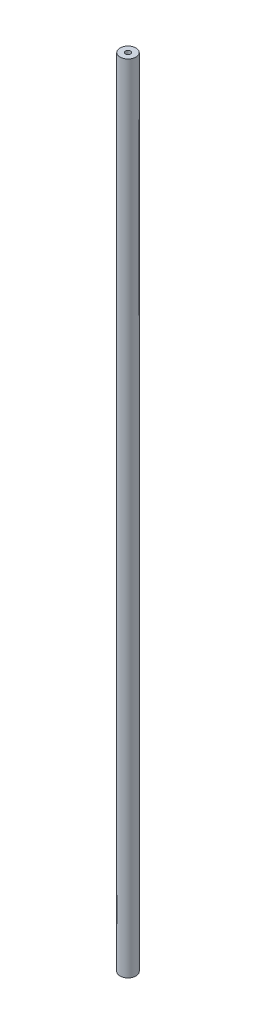
ISO-10303-21;
HEADER;
FILE_DESCRIPTION(('STEP AP214'),'2;1');
FILE_NAME('part.step','',(''),(''),'','','');
FILE_SCHEMA(('AUTOMOTIVE_DESIGN { 1 0 10303 214 1 1 1 1 }'));
ENDSEC;
DATA;
#1=APPLICATION_CONTEXT('core data for automotive mechanical design processes');
#2=APPLICATION_PROTOCOL_DEFINITION('international standard','automotive_design',2000,#1);
#3=PRODUCT_CONTEXT('',#1,'mechanical');
#4=PRODUCT('Part','Part','',(#3));
#5=PRODUCT_RELATED_PRODUCT_CATEGORY('part','',(#4));
#6=PRODUCT_DEFINITION_FORMATION('','',#4);
#7=PRODUCT_DEFINITION_CONTEXT('part definition',#1,'design');
#8=PRODUCT_DEFINITION('design','',#6,#7);
#9=PRODUCT_DEFINITION_SHAPE('','',#8);
#10=(LENGTH_UNIT() NAMED_UNIT(*) SI_UNIT(.MILLI.,.METRE.));
#11=(NAMED_UNIT(*) PLANE_ANGLE_UNIT() SI_UNIT($,.RADIAN.));
#12=(NAMED_UNIT(*) SI_UNIT($,.STERADIAN.) SOLID_ANGLE_UNIT());
#13=UNCERTAINTY_MEASURE_WITH_UNIT(LENGTH_MEASURE(1.E-05),#10,'distance_accuracy_value','');
#14=(GEOMETRIC_REPRESENTATION_CONTEXT(3) GLOBAL_UNCERTAINTY_ASSIGNED_CONTEXT((#13)) GLOBAL_UNIT_ASSIGNED_CONTEXT((#10,
#11,#12)) REPRESENTATION_CONTEXT('',''));
#15=CARTESIAN_POINT('',(0.,0.,0.));
#16=DIRECTION('',(0.,0.,1.));
#17=DIRECTION('',(1.,0.,0.));
#18=AXIS2_PLACEMENT_3D('',#15,#16,#17);
#19=CARTESIAN_POINT('',(0.,634.492,0.));
#20=DIRECTION('',(0.,-1.,0.));
#21=DIRECTION('',(0.,0.,-1.));
#22=AXIS2_PLACEMENT_3D('',#19,#20,#21);
#23=CYLINDRICAL_SURFACE('',#22,6.35);
#24=CARTESIAN_POINT('',(0.,634.492,0.));
#25=DIRECTION('',(0.,1.,0.));
#26=DIRECTION('',(0.,0.,1.));
#27=AXIS2_PLACEMENT_3D('',#24,#25,#26);
#28=CIRCLE('',#27,6.35);
#29=CARTESIAN_POINT('',(0.,634.492,6.35));
#30=VERTEX_POINT('',#29);
#31=EDGE_CURVE('E11',#30,#30,#28,.T.);
#32=ORIENTED_EDGE('',*,*,#31,.F.);
#33=EDGE_LOOP('',(#32));
#34=FACE_BOUND('',#33,.T.);
#35=CARTESIAN_POINT('',(0.,0.,0.));
#36=DIRECTION('',(0.,1.,0.));
#37=DIRECTION('',(0.,0.,1.));
#38=AXIS2_PLACEMENT_3D('',#35,#36,#37);
#39=CIRCLE('',#38,6.35);
#40=CARTESIAN_POINT('',(0.,0.,6.35));
#41=VERTEX_POINT('',#40);
#42=EDGE_CURVE('E52',#41,#41,#39,.T.);
#43=ORIENTED_EDGE('',*,*,#42,.T.);
#44=EDGE_LOOP('',(#43));
#45=FACE_BOUND('',#44,.T.);
#46=ADVANCED_FACE('F49',(#34,#45),#23,.T.);
#47=CARTESIAN_POINT('',(0.,634.492,0.));
#48=DIRECTION('',(0.,1.,0.));
#49=DIRECTION('',(0.,0.,1.));
#50=AXIS2_PLACEMENT_3D('',#47,#48,#49);
#51=PLANE('',#50);
#52=CARTESIAN_POINT('',(0.,634.492,0.));
#53=DIRECTION('',(0.,1.,0.));
#54=DIRECTION('',(0.,0.,1.));
#55=AXIS2_PLACEMENT_3D('',#52,#53,#54);
#56=CIRCLE('',#55,2.0193);
#57=CARTESIAN_POINT('',(0.,634.492,2.0193));
#58=VERTEX_POINT('',#57);
#59=EDGE_CURVE('E75',#58,#58,#56,.T.);
#60=ORIENTED_EDGE('',*,*,#59,.F.);
#61=EDGE_LOOP('',(#60));
#62=FACE_BOUND('',#61,.T.);
#63=ORIENTED_EDGE('',*,*,#31,.T.);
#64=EDGE_LOOP('',(#63));
#65=FACE_BOUND('',#64,.T.);
#66=ADVANCED_FACE('F97',(#62,#65),#51,.T.);
#67=CARTESIAN_POINT('',(0.,0.,0.));
#68=DIRECTION('',(0.,1.,0.));
#69=DIRECTION('',(0.,0.,1.));
#70=AXIS2_PLACEMENT_3D('',#67,#68,#69);
#71=PLANE('',#70);
#72=CARTESIAN_POINT('',(0.,0.,0.));
#73=DIRECTION('',(0.,-1.,0.));
#74=DIRECTION('',(0.,0.,-1.));
#75=AXIS2_PLACEMENT_3D('',#72,#73,#74);
#76=CIRCLE('',#75,2.0193);
#77=CARTESIAN_POINT('',(0.,0.,-2.0193));
#78=VERTEX_POINT('',#77);
#79=EDGE_CURVE('E74',#78,#78,#76,.T.);
#80=ORIENTED_EDGE('',*,*,#79,.F.);
#81=EDGE_LOOP('',(#80));
#82=FACE_BOUND('',#81,.T.);
#83=ORIENTED_EDGE('',*,*,#42,.F.);
#84=EDGE_LOOP('',(#83));
#85=FACE_BOUND('',#84,.T.);
#86=ADVANCED_FACE('F94',(#82,#85),#71,.F.);
#87=CARTESIAN_POINT('',(0.,12.02944,0.));
#88=DIRECTION('',(0.,-1.,0.));
#89=DIRECTION('',(0.,0.,-1.));
#90=AXIS2_PLACEMENT_3D('',#87,#88,#89);
#91=CONICAL_SURFACE('',#90,2.0193,1.02974425867665);
#92=CARTESIAN_POINT('',(0.,13.2427578480024,0.));
#93=VERTEX_POINT('',#92);
#94=VERTEX_LOOP('',#93);
#95=FACE_BOUND('',#94,.T.);
#96=CARTESIAN_POINT('',(0.,12.02944,0.));
#97=DIRECTION('',(0.,-1.,0.));
#98=DIRECTION('',(0.,0.,-1.));
#99=AXIS2_PLACEMENT_3D('',#96,#97,#98);
#100=CIRCLE('',#99,2.0193);
#101=CARTESIAN_POINT('',(0.,12.02944,-2.0193));
#102=VERTEX_POINT('',#101);
#103=EDGE_CURVE('E80',#102,#102,#100,.T.);
#104=ORIENTED_EDGE('',*,*,#103,.T.);
#105=EDGE_LOOP('',(#104));
#106=FACE_BOUND('',#105,.T.);
#107=ADVANCED_FACE('F96',(#95,#106),#91,.F.);
#108=CARTESIAN_POINT('',(0.,0.,0.));
#109=DIRECTION('',(0.,-1.,0.));
#110=DIRECTION('',(0.,0.,-1.));
#111=AXIS2_PLACEMENT_3D('',#108,#109,#110);
#112=CYLINDRICAL_SURFACE('',#111,2.0193);
#113=ORIENTED_EDGE('',*,*,#103,.F.);
#114=EDGE_LOOP('',(#113));
#115=FACE_BOUND('',#114,.T.);
#116=ORIENTED_EDGE('',*,*,#79,.T.);
#117=EDGE_LOOP('',(#116));
#118=FACE_BOUND('',#117,.T.);
#119=ADVANCED_FACE('F67',(#115,#118),#112,.F.);
#120=CARTESIAN_POINT('',(0.,622.46256,0.));
#121=DIRECTION('',(0.,1.,0.));
#122=DIRECTION('',(0.,0.,1.));
#123=AXIS2_PLACEMENT_3D('',#120,#121,#122);
#124=CONICAL_SURFACE('',#123,2.0193,1.02974425867664);
#125=CARTESIAN_POINT('',(0.,621.249242151998,0.));
#126=VERTEX_POINT('',#125);
#127=VERTEX_LOOP('',#126);
#128=FACE_BOUND('',#127,.T.);
#129=CARTESIAN_POINT('',(0.,622.46256,0.));
#130=DIRECTION('',(0.,1.,0.));
#131=DIRECTION('',(0.,0.,1.));
#132=AXIS2_PLACEMENT_3D('',#129,#130,#131);
#133=CIRCLE('',#132,2.0193);
#134=CARTESIAN_POINT('',(0.,622.46256,2.0193));
#135=VERTEX_POINT('',#134);
#136=EDGE_CURVE('E71',#135,#135,#133,.T.);
#137=ORIENTED_EDGE('',*,*,#136,.T.);
#138=EDGE_LOOP('',(#137));
#139=FACE_BOUND('',#138,.T.);
#140=ADVANCED_FACE('F63',(#128,#139),#124,.F.);
#141=CARTESIAN_POINT('',(0.,634.492,0.));
#142=DIRECTION('',(0.,1.,0.));
#143=DIRECTION('',(0.,0.,1.));
#144=AXIS2_PLACEMENT_3D('',#141,#142,#143);
#145=CYLINDRICAL_SURFACE('',#144,2.0193);
#146=ORIENTED_EDGE('',*,*,#136,.F.);
#147=EDGE_LOOP('',(#146));
#148=FACE_BOUND('',#147,.T.);
#149=ORIENTED_EDGE('',*,*,#59,.T.);
#150=EDGE_LOOP('',(#149));
#151=FACE_BOUND('',#150,.T.);
#152=ADVANCED_FACE('F66',(#148,#151),#145,.F.);
#153=CLOSED_SHELL('',(#46,#66,#86,#107,#119,#140,#152));
#154=MANIFOLD_SOLID_BREP('B2',#153);
#155=ADVANCED_BREP_SHAPE_REPRESENTATION('',(#18,#154),#14);
#156=SHAPE_DEFINITION_REPRESENTATION(#9,#155);
ENDSEC;
END-ISO-10303-21;
